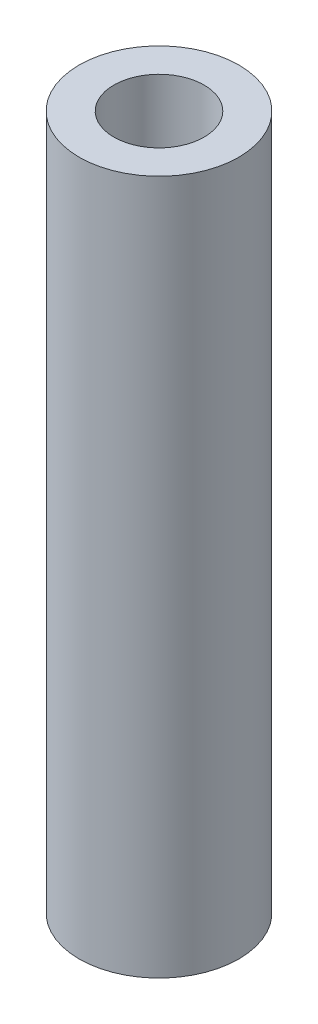
ISO-10303-21;
HEADER;
FILE_DESCRIPTION(('STEP AP214'),'2;1');
FILE_NAME('part.step','',(''),(''),'','','');
FILE_SCHEMA(('AUTOMOTIVE_DESIGN { 1 0 10303 214 1 1 1 1 }'));
ENDSEC;
DATA;
#1=APPLICATION_CONTEXT('core data for automotive mechanical design processes');
#2=APPLICATION_PROTOCOL_DEFINITION('international standard','automotive_design',2000,#1);
#3=PRODUCT_CONTEXT('',#1,'mechanical');
#4=PRODUCT('Part','Part','',(#3));
#5=PRODUCT_RELATED_PRODUCT_CATEGORY('part','',(#4));
#6=PRODUCT_DEFINITION_FORMATION('','',#4);
#7=PRODUCT_DEFINITION_CONTEXT('part definition',#1,'design');
#8=PRODUCT_DEFINITION('design','',#6,#7);
#9=PRODUCT_DEFINITION_SHAPE('','',#8);
#10=(LENGTH_UNIT() NAMED_UNIT(*) SI_UNIT(.MILLI.,.METRE.));
#11=(NAMED_UNIT(*) PLANE_ANGLE_UNIT() SI_UNIT($,.RADIAN.));
#12=(NAMED_UNIT(*) SI_UNIT($,.STERADIAN.) SOLID_ANGLE_UNIT());
#13=UNCERTAINTY_MEASURE_WITH_UNIT(LENGTH_MEASURE(1.E-05),#10,'distance_accuracy_value','');
#14=(GEOMETRIC_REPRESENTATION_CONTEXT(3) GLOBAL_UNCERTAINTY_ASSIGNED_CONTEXT((#13)) GLOBAL_UNIT_ASSIGNED_CONTEXT((#10,
#11,#12)) REPRESENTATION_CONTEXT('',''));
#15=CARTESIAN_POINT('',(0.,0.,0.));
#16=DIRECTION('',(0.,0.,1.));
#17=DIRECTION('',(1.,0.,0.));
#18=AXIS2_PLACEMENT_3D('',#15,#16,#17);
#19=CARTESIAN_POINT('',(0.,25.4,0.));
#20=DIRECTION('',(0.,1.,0.));
#21=DIRECTION('',(0.,0.,1.));
#22=AXIS2_PLACEMENT_3D('',#19,#20,#21);
#23=PLANE('',#22);
#24=CARTESIAN_POINT('',(0.,25.4,0.));
#25=DIRECTION('',(0.,1.,0.));
#26=DIRECTION('',(0.,0.,1.));
#27=AXIS2_PLACEMENT_3D('',#24,#25,#26);
#28=CIRCLE('',#27,2.921);
#29=CARTESIAN_POINT('',(0.,25.4,2.921));
#30=VERTEX_POINT('',#29);
#31=EDGE_CURVE('E10',#30,#30,#28,.T.);
#32=ORIENTED_EDGE('',*,*,#31,.T.);
#33=EDGE_LOOP('',(#32));
#34=FACE_BOUND('',#33,.T.);
#35=CARTESIAN_POINT('',(0.,25.4,0.));
#36=DIRECTION('',(0.,1.,0.));
#37=DIRECTION('',(0.,0.,1.));
#38=AXIS2_PLACEMENT_3D('',#35,#36,#37);
#39=CIRCLE('',#38,1.651);
#40=CARTESIAN_POINT('',(0.,25.4,1.651));
#41=VERTEX_POINT('',#40);
#42=EDGE_CURVE('E43',#41,#41,#39,.T.);
#43=ORIENTED_EDGE('',*,*,#42,.F.);
#44=EDGE_LOOP('',(#43));
#45=FACE_BOUND('',#44,.T.);
#46=ADVANCED_FACE('F32',(#34,#45),#23,.T.);
#47=CARTESIAN_POINT('',(0.,0.,0.));
#48=DIRECTION('',(0.,1.,0.));
#49=DIRECTION('',(0.,0.,1.));
#50=AXIS2_PLACEMENT_3D('',#47,#48,#49);
#51=PLANE('',#50);
#52=CARTESIAN_POINT('',(0.,0.,0.));
#53=DIRECTION('',(0.,1.,0.));
#54=DIRECTION('',(0.,0.,1.));
#55=AXIS2_PLACEMENT_3D('',#52,#53,#54);
#56=CIRCLE('',#55,2.921);
#57=CARTESIAN_POINT('',(0.,0.,2.921));
#58=VERTEX_POINT('',#57);
#59=EDGE_CURVE('E36',#58,#58,#56,.T.);
#60=ORIENTED_EDGE('',*,*,#59,.F.);
#61=EDGE_LOOP('',(#60));
#62=FACE_BOUND('',#61,.T.);
#63=CARTESIAN_POINT('',(0.,0.,0.));
#64=DIRECTION('',(0.,1.,0.));
#65=DIRECTION('',(0.,0.,1.));
#66=AXIS2_PLACEMENT_3D('',#63,#64,#65);
#67=CIRCLE('',#66,1.651);
#68=CARTESIAN_POINT('',(0.,0.,1.651));
#69=VERTEX_POINT('',#68);
#70=EDGE_CURVE('E45',#69,#69,#67,.T.);
#71=ORIENTED_EDGE('',*,*,#70,.T.);
#72=EDGE_LOOP('',(#71));
#73=FACE_BOUND('',#72,.T.);
#74=ADVANCED_FACE('F55',(#62,#73),#51,.F.);
#75=CARTESIAN_POINT('',(0.,25.4,0.));
#76=DIRECTION('',(0.,-1.,0.));
#77=DIRECTION('',(0.,0.,-1.));
#78=AXIS2_PLACEMENT_3D('',#75,#76,#77);
#79=CYLINDRICAL_SURFACE('',#78,2.921);
#80=ORIENTED_EDGE('',*,*,#31,.F.);
#81=EDGE_LOOP('',(#80));
#82=FACE_BOUND('',#81,.T.);
#83=ORIENTED_EDGE('',*,*,#59,.T.);
#84=EDGE_LOOP('',(#83));
#85=FACE_BOUND('',#84,.T.);
#86=ADVANCED_FACE('F34',(#82,#85),#79,.T.);
#87=CARTESIAN_POINT('',(0.,25.4,0.));
#88=DIRECTION('',(0.,-1.,0.));
#89=DIRECTION('',(0.,0.,-1.));
#90=AXIS2_PLACEMENT_3D('',#87,#88,#89);
#91=CYLINDRICAL_SURFACE('',#90,1.651);
#92=ORIENTED_EDGE('',*,*,#42,.T.);
#93=EDGE_LOOP('',(#92));
#94=FACE_BOUND('',#93,.T.);
#95=ORIENTED_EDGE('',*,*,#70,.F.);
#96=EDGE_LOOP('',(#95));
#97=FACE_BOUND('',#96,.T.);
#98=ADVANCED_FACE('F51',(#94,#97),#91,.F.);
#99=CLOSED_SHELL('',(#46,#74,#86,#98));
#100=MANIFOLD_SOLID_BREP('B2',#99);
#101=ADVANCED_BREP_SHAPE_REPRESENTATION('',(#18,#100),#14);
#102=SHAPE_DEFINITION_REPRESENTATION(#9,#101);
ENDSEC;
END-ISO-10303-21;
